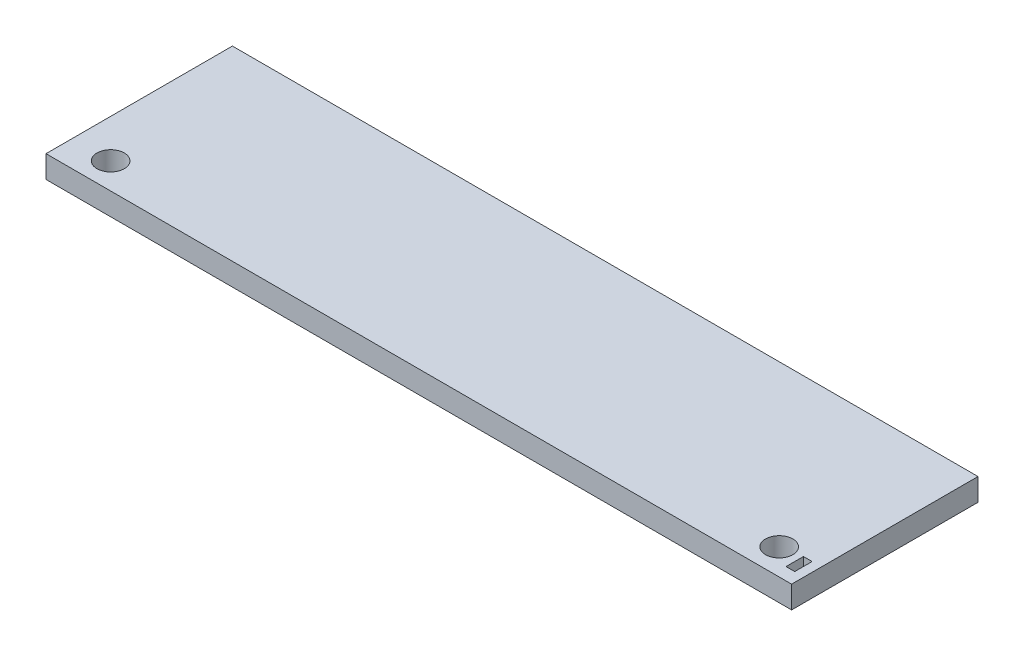
ISO-10303-21;
HEADER;
FILE_DESCRIPTION(('STEP AP214'),'2;1');
FILE_NAME('part.step','',(''),(''),'','','');
FILE_SCHEMA(('AUTOMOTIVE_DESIGN { 1 0 10303 214 1 1 1 1 }'));
ENDSEC;
DATA;
#1=APPLICATION_CONTEXT('core data for automotive mechanical design processes');
#2=APPLICATION_PROTOCOL_DEFINITION('international standard','automotive_design',2000,#1);
#3=PRODUCT_CONTEXT('',#1,'mechanical');
#4=PRODUCT('Part','Part','',(#3));
#5=PRODUCT_RELATED_PRODUCT_CATEGORY('part','',(#4));
#6=PRODUCT_DEFINITION_FORMATION('','',#4);
#7=PRODUCT_DEFINITION_CONTEXT('part definition',#1,'design');
#8=PRODUCT_DEFINITION('design','',#6,#7);
#9=PRODUCT_DEFINITION_SHAPE('','',#8);
#10=(LENGTH_UNIT() NAMED_UNIT(*) SI_UNIT(.MILLI.,.METRE.));
#11=(NAMED_UNIT(*) PLANE_ANGLE_UNIT() SI_UNIT($,.RADIAN.));
#12=(NAMED_UNIT(*) SI_UNIT($,.STERADIAN.) SOLID_ANGLE_UNIT());
#13=UNCERTAINTY_MEASURE_WITH_UNIT(LENGTH_MEASURE(1.E-05),#10,'distance_accuracy_value','');
#14=(GEOMETRIC_REPRESENTATION_CONTEXT(3) GLOBAL_UNCERTAINTY_ASSIGNED_CONTEXT((#13)) GLOBAL_UNIT_ASSIGNED_CONTEXT((#10,
#11,#12)) REPRESENTATION_CONTEXT('',''));
#15=CARTESIAN_POINT('',(0.,0.,0.));
#16=DIRECTION('',(0.,0.,1.));
#17=DIRECTION('',(1.,0.,0.));
#18=AXIS2_PLACEMENT_3D('',#15,#16,#17);
#19=CARTESIAN_POINT('',(300.,18.,-75.));
#20=DIRECTION('',(-1.,0.,0.));
#21=DIRECTION('',(0.,0.,1.));
#22=AXIS2_PLACEMENT_3D('',#19,#20,#21);
#23=PLANE('',#22);
#24=DIRECTION('',(0.,0.,-1.));
#25=VECTOR('',#24,1.);
#26=CARTESIAN_POINT('',(300.,0.,-75.));
#27=LINE('',#26,#25);
#28=CARTESIAN_POINT('',(300.,0.,75.));
#29=VERTEX_POINT('',#28);
#30=CARTESIAN_POINT('',(300.,0.,-75.));
#31=VERTEX_POINT('',#30);
#32=EDGE_CURVE('E166',#29,#31,#27,.T.);
#33=ORIENTED_EDGE('',*,*,#32,.T.);
#34=DIRECTION('',(0.,-1.,0.));
#35=VECTOR('',#34,1.);
#36=CARTESIAN_POINT('',(300.,18.,-75.));
#37=LINE('',#36,#35);
#38=CARTESIAN_POINT('',(300.,18.,-75.));
#39=VERTEX_POINT('',#38);
#40=EDGE_CURVE('E11',#39,#31,#37,.T.);
#41=ORIENTED_EDGE('',*,*,#40,.F.);
#42=DIRECTION('',(0.,0.,-1.));
#43=VECTOR('',#42,1.);
#44=CARTESIAN_POINT('',(300.,18.,-75.));
#45=LINE('',#44,#43);
#46=CARTESIAN_POINT('',(300.,18.,75.));
#47=VERTEX_POINT('',#46);
#48=EDGE_CURVE('E159',#47,#39,#45,.T.);
#49=ORIENTED_EDGE('',*,*,#48,.F.);
#50=DIRECTION('',(0.,-1.,0.));
#51=VECTOR('',#50,1.);
#52=CARTESIAN_POINT('',(300.,18.,75.));
#53=LINE('',#52,#51);
#54=EDGE_CURVE('E165',#47,#29,#53,.T.);
#55=ORIENTED_EDGE('',*,*,#54,.T.);
#56=EDGE_LOOP('',(#33,#41,#49,#55));
#57=FACE_BOUND('',#56,.T.);
#58=ADVANCED_FACE('F39',(#57),#23,.F.);
#59=CARTESIAN_POINT('',(-300.,18.,-75.));
#60=DIRECTION('',(0.,0.,1.));
#61=DIRECTION('',(1.,0.,0.));
#62=AXIS2_PLACEMENT_3D('',#59,#60,#61);
#63=PLANE('',#62);
#64=DIRECTION('',(-1.,0.,0.));
#65=VECTOR('',#64,1.);
#66=CARTESIAN_POINT('',(-300.,0.,-75.));
#67=LINE('',#66,#65);
#68=CARTESIAN_POINT('',(-300.,0.,-75.));
#69=VERTEX_POINT('',#68);
#70=EDGE_CURVE('E169',#31,#69,#67,.T.);
#71=ORIENTED_EDGE('',*,*,#70,.T.);
#72=DIRECTION('',(0.,-1.,0.));
#73=VECTOR('',#72,1.);
#74=CARTESIAN_POINT('',(-300.,18.,-75.));
#75=LINE('',#74,#73);
#76=CARTESIAN_POINT('',(-300.,18.,-75.));
#77=VERTEX_POINT('',#76);
#78=EDGE_CURVE('E47',#77,#69,#75,.T.);
#79=ORIENTED_EDGE('',*,*,#78,.F.);
#80=DIRECTION('',(-1.,0.,0.));
#81=VECTOR('',#80,1.);
#82=CARTESIAN_POINT('',(-300.,18.,-75.));
#83=LINE('',#82,#81);
#84=EDGE_CURVE('E92',#39,#77,#83,.T.);
#85=ORIENTED_EDGE('',*,*,#84,.F.);
#86=ORIENTED_EDGE('',*,*,#40,.T.);
#87=EDGE_LOOP('',(#71,#79,#85,#86));
#88=FACE_BOUND('',#87,.T.);
#89=ADVANCED_FACE('F200',(#88),#63,.F.);
#90=CARTESIAN_POINT('',(-300.,18.,-75.));
#91=DIRECTION('',(1.,0.,0.));
#92=DIRECTION('',(0.,0.,-1.));
#93=AXIS2_PLACEMENT_3D('',#90,#91,#92);
#94=PLANE('',#93);
#95=DIRECTION('',(0.,0.,1.));
#96=VECTOR('',#95,1.);
#97=CARTESIAN_POINT('',(-300.,0.,-75.));
#98=LINE('',#97,#96);
#99=CARTESIAN_POINT('',(-300.,0.,75.));
#100=VERTEX_POINT('',#99);
#101=EDGE_CURVE('E171',#69,#100,#98,.T.);
#102=ORIENTED_EDGE('',*,*,#101,.T.);
#103=DIRECTION('',(0.,-1.,0.));
#104=VECTOR('',#103,1.);
#105=CARTESIAN_POINT('',(-300.,18.,75.));
#106=LINE('',#105,#104);
#107=CARTESIAN_POINT('',(-300.,18.,75.));
#108=VERTEX_POINT('',#107);
#109=EDGE_CURVE('E175',#108,#100,#106,.T.);
#110=ORIENTED_EDGE('',*,*,#109,.F.);
#111=DIRECTION('',(0.,0.,1.));
#112=VECTOR('',#111,1.);
#113=CARTESIAN_POINT('',(-300.,18.,-75.));
#114=LINE('',#113,#112);
#115=EDGE_CURVE('E162',#77,#108,#114,.T.);
#116=ORIENTED_EDGE('',*,*,#115,.F.);
#117=ORIENTED_EDGE('',*,*,#78,.T.);
#118=EDGE_LOOP('',(#102,#110,#116,#117));
#119=FACE_BOUND('',#118,.T.);
#120=ADVANCED_FACE('F205',(#119),#94,.F.);
#121=CARTESIAN_POINT('',(-300.,18.,75.));
#122=DIRECTION('',(0.,0.,-1.));
#123=DIRECTION('',(-1.,0.,0.));
#124=AXIS2_PLACEMENT_3D('',#121,#122,#123);
#125=PLANE('',#124);
#126=DIRECTION('',(1.,0.,0.));
#127=VECTOR('',#126,1.);
#128=CARTESIAN_POINT('',(-300.,0.,75.));
#129=LINE('',#128,#127);
#130=EDGE_CURVE('E85',#100,#29,#129,.T.);
#131=ORIENTED_EDGE('',*,*,#130,.T.);
#132=ORIENTED_EDGE('',*,*,#54,.F.);
#133=DIRECTION('',(1.,0.,0.));
#134=VECTOR('',#133,1.);
#135=CARTESIAN_POINT('',(-300.,18.,75.));
#136=LINE('',#135,#134);
#137=EDGE_CURVE('E64',#108,#47,#136,.T.);
#138=ORIENTED_EDGE('',*,*,#137,.F.);
#139=ORIENTED_EDGE('',*,*,#109,.T.);
#140=EDGE_LOOP('',(#131,#132,#138,#139));
#141=FACE_BOUND('',#140,.T.);
#142=ADVANCED_FACE('F216',(#141),#125,.F.);
#143=CARTESIAN_POINT('',(0.,18.,0.));
#144=DIRECTION('',(0.,1.,0.));
#145=DIRECTION('',(0.,0.,1.));
#146=AXIS2_PLACEMENT_3D('',#143,#144,#145);
#147=PLANE('',#146);
#148=DIRECTION('',(0.,0.,-1.));
#149=VECTOR('',#148,1.);
#150=CARTESIAN_POINT('',(292.5,18.,51.));
#151=LINE('',#150,#149);
#152=CARTESIAN_POINT('',(292.5,18.,65.));
#153=VERTEX_POINT('',#152);
#154=CARTESIAN_POINT('',(292.5,18.,51.));
#155=VERTEX_POINT('',#154);
#156=EDGE_CURVE('E55',#153,#155,#151,.T.);
#157=ORIENTED_EDGE('',*,*,#156,.F.);
#158=DIRECTION('',(1.,0.,0.));
#159=VECTOR('',#158,1.);
#160=CARTESIAN_POINT('',(285.5,18.,65.));
#161=LINE('',#160,#159);
#162=CARTESIAN_POINT('',(285.5,18.,65.));
#163=VERTEX_POINT('',#162);
#164=EDGE_CURVE('E134',#163,#153,#161,.T.);
#165=ORIENTED_EDGE('',*,*,#164,.F.);
#166=DIRECTION('',(0.,0.,1.));
#167=VECTOR('',#166,1.);
#168=CARTESIAN_POINT('',(285.5,18.,51.));
#169=LINE('',#168,#167);
#170=CARTESIAN_POINT('',(285.5,18.,51.));
#171=VERTEX_POINT('',#170);
#172=EDGE_CURVE('E137',#171,#163,#169,.T.);
#173=ORIENTED_EDGE('',*,*,#172,.F.);
#174=DIRECTION('',(-1.,0.,0.));
#175=VECTOR('',#174,1.);
#176=CARTESIAN_POINT('',(285.5,18.,51.));
#177=LINE('',#176,#175);
#178=EDGE_CURVE('E143',#155,#171,#177,.T.);
#179=ORIENTED_EDGE('',*,*,#178,.F.);
#180=EDGE_LOOP('',(#157,#165,#173,#179));
#181=FACE_BOUND('',#180,.T.);
#182=CARTESIAN_POINT('',(269.,18.,54.));
#183=DIRECTION('',(0.,1.,0.));
#184=DIRECTION('',(0.,0.,1.));
#185=AXIS2_PLACEMENT_3D('',#182,#183,#184);
#186=CIRCLE('',#185,11.);
#187=CARTESIAN_POINT('',(269.,18.,65.));
#188=VERTEX_POINT('',#187);
#189=EDGE_CURVE('E153',#188,#188,#186,.T.);
#190=ORIENTED_EDGE('',*,*,#189,.F.);
#191=EDGE_LOOP('',(#190));
#192=FACE_BOUND('',#191,.T.);
#193=CARTESIAN_POINT('',(-269.,18.,54.));
#194=DIRECTION('',(0.,1.,0.));
#195=DIRECTION('',(0.,0.,1.));
#196=AXIS2_PLACEMENT_3D('',#193,#194,#195);
#197=CIRCLE('',#196,11.);
#198=CARTESIAN_POINT('',(-269.,18.,65.));
#199=VERTEX_POINT('',#198);
#200=EDGE_CURVE('E149',#199,#199,#197,.T.);
#201=ORIENTED_EDGE('',*,*,#200,.F.);
#202=EDGE_LOOP('',(#201));
#203=FACE_BOUND('',#202,.T.);
#204=ORIENTED_EDGE('',*,*,#48,.T.);
#205=ORIENTED_EDGE('',*,*,#84,.T.);
#206=ORIENTED_EDGE('',*,*,#115,.T.);
#207=ORIENTED_EDGE('',*,*,#137,.T.);
#208=EDGE_LOOP('',(#204,#205,#206,#207));
#209=FACE_BOUND('',#208,.T.);
#210=ADVANCED_FACE('F214',(#181,#192,#203,#209),#147,.T.);
#211=CARTESIAN_POINT('',(0.,0.,0.));
#212=DIRECTION('',(0.,1.,0.));
#213=DIRECTION('',(0.,0.,1.));
#214=AXIS2_PLACEMENT_3D('',#211,#212,#213);
#215=PLANE('',#214);
#216=CARTESIAN_POINT('',(269.,0.,54.));
#217=DIRECTION('',(0.,1.,0.));
#218=DIRECTION('',(0.,0.,1.));
#219=AXIS2_PLACEMENT_3D('',#216,#217,#218);
#220=CIRCLE('',#219,11.);
#221=CARTESIAN_POINT('',(269.,0.,65.));
#222=VERTEX_POINT('',#221);
#223=EDGE_CURVE('E42',#222,#222,#220,.T.);
#224=ORIENTED_EDGE('',*,*,#223,.T.);
#225=EDGE_LOOP('',(#224));
#226=FACE_BOUND('',#225,.T.);
#227=CARTESIAN_POINT('',(-269.,0.,54.));
#228=DIRECTION('',(0.,1.,0.));
#229=DIRECTION('',(0.,0.,1.));
#230=AXIS2_PLACEMENT_3D('',#227,#228,#229);
#231=CIRCLE('',#230,11.);
#232=CARTESIAN_POINT('',(-269.,0.,65.));
#233=VERTEX_POINT('',#232);
#234=EDGE_CURVE('E156',#233,#233,#231,.T.);
#235=ORIENTED_EDGE('',*,*,#234,.T.);
#236=EDGE_LOOP('',(#235));
#237=FACE_BOUND('',#236,.T.);
#238=ORIENTED_EDGE('',*,*,#32,.F.);
#239=ORIENTED_EDGE('',*,*,#130,.F.);
#240=ORIENTED_EDGE('',*,*,#101,.F.);
#241=ORIENTED_EDGE('',*,*,#70,.F.);
#242=EDGE_LOOP('',(#238,#239,#240,#241));
#243=FACE_BOUND('',#242,.T.);
#244=ADVANCED_FACE('F184',(#226,#237,#243),#215,.F.);
#245=CARTESIAN_POINT('',(-269.,-2.,54.));
#246=DIRECTION('',(0.,1.,0.));
#247=DIRECTION('',(0.,0.,1.));
#248=AXIS2_PLACEMENT_3D('',#245,#246,#247);
#249=CYLINDRICAL_SURFACE('',#248,11.);
#250=ORIENTED_EDGE('',*,*,#200,.T.);
#251=EDGE_LOOP('',(#250));
#252=FACE_BOUND('',#251,.T.);
#253=ORIENTED_EDGE('',*,*,#234,.F.);
#254=EDGE_LOOP('',(#253));
#255=FACE_BOUND('',#254,.T.);
#256=ADVANCED_FACE('F188',(#252,#255),#249,.F.);
#257=CARTESIAN_POINT('',(269.,-2.,54.));
#258=DIRECTION('',(0.,1.,0.));
#259=DIRECTION('',(0.,0.,1.));
#260=AXIS2_PLACEMENT_3D('',#257,#258,#259);
#261=CYLINDRICAL_SURFACE('',#260,11.);
#262=ORIENTED_EDGE('',*,*,#189,.T.);
#263=EDGE_LOOP('',(#262));
#264=FACE_BOUND('',#263,.T.);
#265=ORIENTED_EDGE('',*,*,#223,.F.);
#266=EDGE_LOOP('',(#265));
#267=FACE_BOUND('',#266,.T.);
#268=ADVANCED_FACE('F186',(#264,#267),#261,.F.);
#269=CARTESIAN_POINT('',(292.5,6.,51.));
#270=DIRECTION('',(1.,0.,0.));
#271=DIRECTION('',(0.,0.,-1.));
#272=AXIS2_PLACEMENT_3D('',#269,#270,#271);
#273=PLANE('',#272);
#274=ORIENTED_EDGE('',*,*,#156,.T.);
#275=DIRECTION('',(0.,1.,0.));
#276=VECTOR('',#275,1.);
#277=CARTESIAN_POINT('',(292.5,6.,51.));
#278=LINE('',#277,#276);
#279=CARTESIAN_POINT('',(292.5,6.,51.));
#280=VERTEX_POINT('',#279);
#281=EDGE_CURVE('E112',#280,#155,#278,.T.);
#282=ORIENTED_EDGE('',*,*,#281,.F.);
#283=DIRECTION('',(0.,0.,-1.));
#284=VECTOR('',#283,1.);
#285=CARTESIAN_POINT('',(292.5,6.,51.));
#286=LINE('',#285,#284);
#287=CARTESIAN_POINT('',(292.5,6.,65.));
#288=VERTEX_POINT('',#287);
#289=EDGE_CURVE('E116',#288,#280,#286,.T.);
#290=ORIENTED_EDGE('',*,*,#289,.F.);
#291=DIRECTION('',(0.,1.,0.));
#292=VECTOR('',#291,1.);
#293=CARTESIAN_POINT('',(292.5,6.,65.));
#294=LINE('',#293,#292);
#295=EDGE_CURVE('E147',#288,#153,#294,.T.);
#296=ORIENTED_EDGE('',*,*,#295,.T.);
#297=EDGE_LOOP('',(#274,#282,#290,#296));
#298=FACE_BOUND('',#297,.T.);
#299=ADVANCED_FACE('F114',(#298),#273,.F.);
#300=CARTESIAN_POINT('',(285.5,6.,65.));
#301=DIRECTION('',(0.,0.,1.));
#302=DIRECTION('',(1.,0.,0.));
#303=AXIS2_PLACEMENT_3D('',#300,#301,#302);
#304=PLANE('',#303);
#305=ORIENTED_EDGE('',*,*,#164,.T.);
#306=ORIENTED_EDGE('',*,*,#295,.F.);
#307=DIRECTION('',(1.,0.,0.));
#308=VECTOR('',#307,1.);
#309=CARTESIAN_POINT('',(285.5,6.,65.));
#310=LINE('',#309,#308);
#311=CARTESIAN_POINT('',(285.5,6.,65.));
#312=VERTEX_POINT('',#311);
#313=EDGE_CURVE('E122',#312,#288,#310,.T.);
#314=ORIENTED_EDGE('',*,*,#313,.F.);
#315=DIRECTION('',(0.,1.,0.));
#316=VECTOR('',#315,1.);
#317=CARTESIAN_POINT('',(285.5,6.,65.));
#318=LINE('',#317,#316);
#319=EDGE_CURVE('E150',#312,#163,#318,.T.);
#320=ORIENTED_EDGE('',*,*,#319,.T.);
#321=EDGE_LOOP('',(#305,#306,#314,#320));
#322=FACE_BOUND('',#321,.T.);
#323=ADVANCED_FACE('F195',(#322),#304,.F.);
#324=CARTESIAN_POINT('',(285.5,6.,51.));
#325=DIRECTION('',(-1.,0.,0.));
#326=DIRECTION('',(0.,0.,1.));
#327=AXIS2_PLACEMENT_3D('',#324,#325,#326);
#328=PLANE('',#327);
#329=ORIENTED_EDGE('',*,*,#172,.T.);
#330=ORIENTED_EDGE('',*,*,#319,.F.);
#331=DIRECTION('',(0.,0.,1.));
#332=VECTOR('',#331,1.);
#333=CARTESIAN_POINT('',(285.5,6.,51.));
#334=LINE('',#333,#332);
#335=CARTESIAN_POINT('',(285.5,6.,51.));
#336=VERTEX_POINT('',#335);
#337=EDGE_CURVE('E130',#336,#312,#334,.T.);
#338=ORIENTED_EDGE('',*,*,#337,.F.);
#339=DIRECTION('',(0.,1.,0.));
#340=VECTOR('',#339,1.);
#341=CARTESIAN_POINT('',(285.5,6.,51.));
#342=LINE('',#341,#340);
#343=EDGE_CURVE('E121',#336,#171,#342,.T.);
#344=ORIENTED_EDGE('',*,*,#343,.T.);
#345=EDGE_LOOP('',(#329,#330,#338,#344));
#346=FACE_BOUND('',#345,.T.);
#347=ADVANCED_FACE('F277',(#346),#328,.F.);
#348=CARTESIAN_POINT('',(285.5,6.,51.));
#349=DIRECTION('',(0.,0.,-1.));
#350=DIRECTION('',(-1.,0.,0.));
#351=AXIS2_PLACEMENT_3D('',#348,#349,#350);
#352=PLANE('',#351);
#353=ORIENTED_EDGE('',*,*,#178,.T.);
#354=ORIENTED_EDGE('',*,*,#343,.F.);
#355=DIRECTION('',(-1.,0.,0.));
#356=VECTOR('',#355,1.);
#357=CARTESIAN_POINT('',(285.5,6.,51.));
#358=LINE('',#357,#356);
#359=EDGE_CURVE('E125',#280,#336,#358,.T.);
#360=ORIENTED_EDGE('',*,*,#359,.F.);
#361=ORIENTED_EDGE('',*,*,#281,.T.);
#362=EDGE_LOOP('',(#353,#354,#360,#361));
#363=FACE_BOUND('',#362,.T.);
#364=ADVANCED_FACE('F126',(#363),#352,.F.);
#365=CARTESIAN_POINT('',(0.,6.,0.));
#366=DIRECTION('',(0.,1.,0.));
#367=DIRECTION('',(0.,0.,1.));
#368=AXIS2_PLACEMENT_3D('',#365,#366,#367);
#369=PLANE('',#368);
#370=ORIENTED_EDGE('',*,*,#289,.T.);
#371=ORIENTED_EDGE('',*,*,#359,.T.);
#372=ORIENTED_EDGE('',*,*,#337,.T.);
#373=ORIENTED_EDGE('',*,*,#313,.T.);
#374=EDGE_LOOP('',(#370,#371,#372,#373));
#375=FACE_BOUND('',#374,.T.);
#376=ADVANCED_FACE('F132',(#375),#369,.T.);
#377=CLOSED_SHELL('',(#58,#89,#120,#142,#210,#244,#256,#268,#299,#323,#347,#364,#376));
#378=MANIFOLD_SOLID_BREP('B2',#377);
#379=ADVANCED_BREP_SHAPE_REPRESENTATION('',(#18,#378),#14);
#380=SHAPE_DEFINITION_REPRESENTATION(#9,#379);
ENDSEC;
END-ISO-10303-21;
